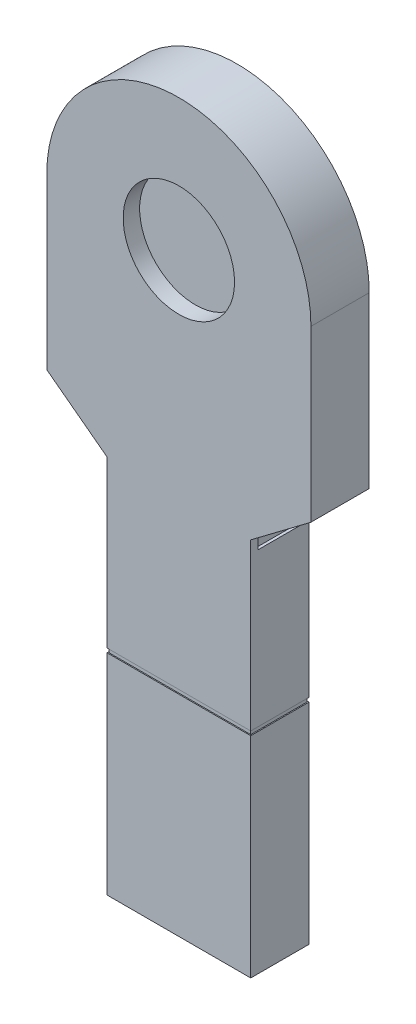
ISO-10303-21;
HEADER;
FILE_DESCRIPTION(('STEP AP214'),'2;1');
FILE_NAME('part.step','',(''),(''),'','','');
FILE_SCHEMA(('AUTOMOTIVE_DESIGN { 1 0 10303 214 1 1 1 1 }'));
ENDSEC;
DATA;
#1=APPLICATION_CONTEXT('core data for automotive mechanical design processes');
#2=APPLICATION_PROTOCOL_DEFINITION('international standard','automotive_design',2000,#1);
#3=PRODUCT_CONTEXT('',#1,'mechanical');
#4=PRODUCT('Part','Part','',(#3));
#5=PRODUCT_RELATED_PRODUCT_CATEGORY('part','',(#4));
#6=PRODUCT_DEFINITION_FORMATION('','',#4);
#7=PRODUCT_DEFINITION_CONTEXT('part definition',#1,'design');
#8=PRODUCT_DEFINITION('design','',#6,#7);
#9=PRODUCT_DEFINITION_SHAPE('','',#8);
#10=(LENGTH_UNIT() NAMED_UNIT(*) SI_UNIT(.MILLI.,.METRE.));
#11=(NAMED_UNIT(*) PLANE_ANGLE_UNIT() SI_UNIT($,.RADIAN.));
#12=(NAMED_UNIT(*) SI_UNIT($,.STERADIAN.) SOLID_ANGLE_UNIT());
#13=UNCERTAINTY_MEASURE_WITH_UNIT(LENGTH_MEASURE(1.E-05),#10,'distance_accuracy_value','');
#14=(GEOMETRIC_REPRESENTATION_CONTEXT(3) GLOBAL_UNCERTAINTY_ASSIGNED_CONTEXT((#13)) GLOBAL_UNIT_ASSIGNED_CONTEXT((#10,
#11,#12)) REPRESENTATION_CONTEXT('',''));
#15=CARTESIAN_POINT('',(0.,0.,0.));
#16=DIRECTION('',(0.,0.,1.));
#17=DIRECTION('',(1.,0.,0.));
#18=AXIS2_PLACEMENT_3D('',#15,#16,#17);
#19=CARTESIAN_POINT('',(-102.,-131.,45.));
#20=DIRECTION('',(0.601815023152047,0.798635510047294,0.));
#21=DIRECTION('',(-0.798635510047294,0.601815023152047,0.));
#22=AXIS2_PLACEMENT_3D('',#19,#20,#21);
#23=PLANE('',#22);
#24=DIRECTION('',(0.798635510047294,-0.601815023152047,0.));
#25=VECTOR('',#24,1.);
#26=CARTESIAN_POINT('',(-91.8573290223994,-138.643050794031,5.75));
#27=LINE('',#26,#25);
#28=CARTESIAN_POINT('',(-91.8573290223994,-138.643050794031,5.75));
#29=VERTEX_POINT('',#28);
#30=CARTESIAN_POINT('',(-55.4999999999996,-166.04026332978,5.74999999999999));
#31=VERTEX_POINT('',#30);
#32=EDGE_CURVE('E592',#29,#31,#27,.T.);
#33=ORIENTED_EDGE('',*,*,#32,.F.);
#34=DIRECTION('',(0.,0.,-1.));
#35=VECTOR('',#34,1.);
#36=CARTESIAN_POINT('',(-91.8573290223994,-138.643050794031,39.25));
#37=LINE('',#36,#35);
#38=CARTESIAN_POINT('',(-91.8573290223994,-138.643050794031,39.25));
#39=VERTEX_POINT('',#38);
#40=EDGE_CURVE('E587',#39,#29,#37,.T.);
#41=ORIENTED_EDGE('',*,*,#40,.F.);
#42=DIRECTION('',(0.798635510047294,-0.601815023152047,0.));
#43=VECTOR('',#42,1.);
#44=CARTESIAN_POINT('',(-91.8573290223994,-138.643050794031,39.25));
#45=LINE('',#44,#43);
#46=CARTESIAN_POINT('',(-55.4999999999996,-166.04026332978,39.25));
#47=VERTEX_POINT('',#46);
#48=EDGE_CURVE('E596',#39,#47,#45,.T.);
#49=ORIENTED_EDGE('',*,*,#48,.T.);
#50=DIRECTION('',(0.,0.,-1.));
#51=VECTOR('',#50,1.);
#52=CARTESIAN_POINT('',(-55.5,-166.04026332978,45.));
#53=LINE('',#52,#51);
#54=CARTESIAN_POINT('',(-55.5,-166.04026332978,45.));
#55=VERTEX_POINT('',#54);
#56=EDGE_CURVE('E305',#55,#47,#53,.T.);
#57=ORIENTED_EDGE('',*,*,#56,.F.);
#58=DIRECTION('',(0.798635510047294,-0.601815023152047,0.));
#59=VECTOR('',#58,1.);
#60=CARTESIAN_POINT('',(-102.,-131.,45.));
#61=LINE('',#60,#59);
#62=CARTESIAN_POINT('',(-102.,-131.,45.));
#63=VERTEX_POINT('',#62);
#64=EDGE_CURVE('E472',#63,#55,#61,.T.);
#65=ORIENTED_EDGE('',*,*,#64,.F.);
#66=DIRECTION('',(0.,0.,-1.));
#67=VECTOR('',#66,1.);
#68=CARTESIAN_POINT('',(-102.,-131.,45.));
#69=LINE('',#68,#67);
#70=CARTESIAN_POINT('',(-102.,-131.,0.));
#71=VERTEX_POINT('',#70);
#72=EDGE_CURVE('E50',#63,#71,#69,.T.);
#73=ORIENTED_EDGE('',*,*,#72,.T.);
#74=DIRECTION('',(0.798635510047294,-0.601815023152047,0.));
#75=VECTOR('',#74,1.);
#76=CARTESIAN_POINT('',(-102.,-131.,0.));
#77=LINE('',#76,#75);
#78=CARTESIAN_POINT('',(-55.5,-166.04026332978,0.));
#79=VERTEX_POINT('',#78);
#80=EDGE_CURVE('E272',#71,#79,#77,.T.);
#81=ORIENTED_EDGE('',*,*,#80,.T.);
#82=EDGE_CURVE('E256',#31,#79,#53,.T.);
#83=ORIENTED_EDGE('',*,*,#82,.F.);
#84=EDGE_LOOP('',(#33,#41,#49,#57,#65,#73,#81,#83));
#85=FACE_BOUND('',#84,.T.);
#86=ADVANCED_FACE('F40',(#85),#23,.F.);
#87=CARTESIAN_POINT('',(-55.5,-166.04026332978,45.));
#88=DIRECTION('',(1.,0.,0.));
#89=DIRECTION('',(0.,1.,0.));
#90=AXIS2_PLACEMENT_3D('',#87,#88,#89);
#91=PLANE('',#90);
#92=DIRECTION('',(0.,-1.,0.));
#93=VECTOR('',#92,1.);
#94=CARTESIAN_POINT('',(-55.5,-166.04026332978,0.));
#95=LINE('',#94,#93);
#96=CARTESIAN_POINT('',(-55.5,-293.84026332978,0.));
#97=VERTEX_POINT('',#96);
#98=EDGE_CURVE('E276',#79,#97,#95,.T.);
#99=ORIENTED_EDGE('',*,*,#98,.T.);
#100=DIRECTION('',(0.,0.,1.));
#101=VECTOR('',#100,1.);
#102=CARTESIAN_POINT('',(-55.5,-293.84026332978,0.));
#103=LINE('',#102,#101);
#104=CARTESIAN_POINT('',(-55.5,-293.84026332978,45.));
#105=VERTEX_POINT('',#104);
#106=EDGE_CURVE('E58',#97,#105,#103,.T.);
#107=ORIENTED_EDGE('',*,*,#106,.T.);
#108=DIRECTION('',(0.,-1.,0.));
#109=VECTOR('',#108,1.);
#110=CARTESIAN_POINT('',(-55.5,-166.04026332978,45.));
#111=LINE('',#110,#109);
#112=EDGE_CURVE('E475',#55,#105,#111,.T.);
#113=ORIENTED_EDGE('',*,*,#112,.F.);
#114=ORIENTED_EDGE('',*,*,#56,.T.);
#115=DIRECTION('',(0.,-1.,0.));
#116=VECTOR('',#115,1.);
#117=CARTESIAN_POINT('',(-55.4999999999996,-166.04026332978,39.25));
#118=LINE('',#117,#116);
#119=CARTESIAN_POINT('',(-55.4999999999996,-175.490610900131,39.25));
#120=VERTEX_POINT('',#119);
#121=EDGE_CURVE('E606',#47,#120,#118,.T.);
#122=ORIENTED_EDGE('',*,*,#121,.T.);
#123=DIRECTION('',(0.,0.,-1.));
#124=VECTOR('',#123,1.);
#125=CARTESIAN_POINT('',(-55.4999999999996,-175.490610900131,39.25));
#126=LINE('',#125,#124);
#127=CARTESIAN_POINT('',(-55.5,-175.490610900131,5.74999999999999));
#128=VERTEX_POINT('',#127);
#129=EDGE_CURVE('E610',#120,#128,#126,.T.);
#130=ORIENTED_EDGE('',*,*,#129,.T.);
#131=DIRECTION('',(0.,-1.,0.));
#132=VECTOR('',#131,1.);
#133=CARTESIAN_POINT('',(-55.4999999999996,-166.04026332978,5.74999999999999));
#134=LINE('',#133,#132);
#135=EDGE_CURVE('E601',#31,#128,#134,.T.);
#136=ORIENTED_EDGE('',*,*,#135,.F.);
#137=ORIENTED_EDGE('',*,*,#82,.T.);
#138=EDGE_LOOP('',(#99,#107,#113,#114,#122,#130,#136,#137));
#139=FACE_BOUND('',#138,.T.);
#140=ADVANCED_FACE('F448',(#139),#91,.F.);
#141=CARTESIAN_POINT('',(55.5,-459.04026332978,45.));
#142=DIRECTION('',(-1.,0.,0.));
#143=DIRECTION('',(0.,0.,1.));
#144=AXIS2_PLACEMENT_3D('',#141,#142,#143);
#145=PLANE('',#144);
#146=DIRECTION('',(0.,1.,0.));
#147=VECTOR('',#146,1.);
#148=CARTESIAN_POINT('',(55.5,-459.04026332978,45.));
#149=LINE('',#148,#147);
#150=CARTESIAN_POINT('',(55.5,-293.84026332978,45.));
#151=VERTEX_POINT('',#150);
#152=CARTESIAN_POINT('',(55.5,-166.04026332978,45.));
#153=VERTEX_POINT('',#152);
#154=EDGE_CURVE('E44',#151,#153,#149,.T.);
#155=ORIENTED_EDGE('',*,*,#154,.F.);
#156=DIRECTION('',(0.,0.,1.));
#157=VECTOR('',#156,1.);
#158=CARTESIAN_POINT('',(55.5,-293.84026332978,-6.59696900098822));
#159=LINE('',#158,#157);
#160=CARTESIAN_POINT('',(55.5,-293.84026332978,0.));
#161=VERTEX_POINT('',#160);
#162=EDGE_CURVE('E654',#161,#151,#159,.T.);
#163=ORIENTED_EDGE('',*,*,#162,.F.);
#164=DIRECTION('',(0.,1.,0.));
#165=VECTOR('',#164,1.);
#166=CARTESIAN_POINT('',(55.5,-459.04026332978,0.));
#167=LINE('',#166,#165);
#168=CARTESIAN_POINT('',(55.5,-166.04026332978,0.));
#169=VERTEX_POINT('',#168);
#170=EDGE_CURVE('E281',#161,#169,#167,.T.);
#171=ORIENTED_EDGE('',*,*,#170,.T.);
#172=DIRECTION('',(0.,0.,-1.));
#173=VECTOR('',#172,1.);
#174=CARTESIAN_POINT('',(55.5,-166.04026332978,45.));
#175=LINE('',#174,#173);
#176=CARTESIAN_POINT('',(55.4999999999996,-166.04026332978,5.74999999999999));
#177=VERTEX_POINT('',#176);
#178=EDGE_CURVE('E293',#177,#169,#175,.T.);
#179=ORIENTED_EDGE('',*,*,#178,.F.);
#180=DIRECTION('',(0.,-1.,0.));
#181=VECTOR('',#180,1.);
#182=CARTESIAN_POINT('',(55.4999999999996,-166.04026332978,5.74999999999999));
#183=LINE('',#182,#181);
#184=CARTESIAN_POINT('',(55.4999999999996,-175.490610900131,5.74999999999999));
#185=VERTEX_POINT('',#184);
#186=EDGE_CURVE('E500',#177,#185,#183,.T.);
#187=ORIENTED_EDGE('',*,*,#186,.T.);
#188=DIRECTION('',(0.,0.,-1.));
#189=VECTOR('',#188,1.);
#190=CARTESIAN_POINT('',(55.4999999999996,-175.490610900131,39.25));
#191=LINE('',#190,#189);
#192=CARTESIAN_POINT('',(55.4999999999996,-175.490610900131,39.25));
#193=VERTEX_POINT('',#192);
#194=EDGE_CURVE('E494',#193,#185,#191,.T.);
#195=ORIENTED_EDGE('',*,*,#194,.F.);
#196=DIRECTION('',(0.,-1.,0.));
#197=VECTOR('',#196,1.);
#198=CARTESIAN_POINT('',(55.4999999999996,-166.04026332978,39.25));
#199=LINE('',#198,#197);
#200=CARTESIAN_POINT('',(55.4999999999996,-166.04026332978,39.25));
#201=VERTEX_POINT('',#200);
#202=EDGE_CURVE('E503',#201,#193,#199,.T.);
#203=ORIENTED_EDGE('',*,*,#202,.F.);
#204=EDGE_CURVE('E301',#153,#201,#175,.T.);
#205=ORIENTED_EDGE('',*,*,#204,.F.);
#206=EDGE_LOOP('',(#155,#163,#171,#179,#187,#195,#203,#205));
#207=FACE_BOUND('',#206,.T.);
#208=ADVANCED_FACE('F444',(#207),#145,.F.);
#209=CARTESIAN_POINT('',(102.,-131.,45.));
#210=DIRECTION('',(-0.601815023152047,0.798635510047294,0.));
#211=DIRECTION('',(-0.798635510047294,-0.601815023152047,0.));
#212=AXIS2_PLACEMENT_3D('',#209,#210,#211);
#213=PLANE('',#212);
#214=DIRECTION('',(-0.798635510047294,-0.601815023152047,0.));
#215=VECTOR('',#214,1.);
#216=CARTESIAN_POINT('',(91.8573290223994,-138.643050794031,5.75));
#217=LINE('',#216,#215);
#218=CARTESIAN_POINT('',(91.8573290223994,-138.643050794031,5.75));
#219=VERTEX_POINT('',#218);
#220=EDGE_CURVE('E509',#219,#177,#217,.T.);
#221=ORIENTED_EDGE('',*,*,#220,.T.);
#222=ORIENTED_EDGE('',*,*,#178,.T.);
#223=DIRECTION('',(0.798635510047294,0.601815023152047,0.));
#224=VECTOR('',#223,1.);
#225=CARTESIAN_POINT('',(102.,-131.,0.));
#226=LINE('',#225,#224);
#227=CARTESIAN_POINT('',(102.,-131.,0.));
#228=VERTEX_POINT('',#227);
#229=EDGE_CURVE('E283',#169,#228,#226,.T.);
#230=ORIENTED_EDGE('',*,*,#229,.T.);
#231=DIRECTION('',(0.,0.,-1.));
#232=VECTOR('',#231,1.);
#233=CARTESIAN_POINT('',(102.,-131.,45.));
#234=LINE('',#233,#232);
#235=CARTESIAN_POINT('',(102.,-131.,45.));
#236=VERTEX_POINT('',#235);
#237=EDGE_CURVE('E290',#236,#228,#234,.T.);
#238=ORIENTED_EDGE('',*,*,#237,.F.);
#239=DIRECTION('',(0.798635510047294,0.601815023152047,0.));
#240=VECTOR('',#239,1.);
#241=CARTESIAN_POINT('',(102.,-131.,45.));
#242=LINE('',#241,#240);
#243=EDGE_CURVE('E252',#153,#236,#242,.T.);
#244=ORIENTED_EDGE('',*,*,#243,.F.);
#245=ORIENTED_EDGE('',*,*,#204,.T.);
#246=DIRECTION('',(-0.798635510047294,-0.601815023152047,0.));
#247=VECTOR('',#246,1.);
#248=CARTESIAN_POINT('',(91.8573290223994,-138.643050794031,39.25));
#249=LINE('',#248,#247);
#250=CARTESIAN_POINT('',(91.8573290223994,-138.643050794031,39.25));
#251=VERTEX_POINT('',#250);
#252=EDGE_CURVE('E517',#251,#201,#249,.T.);
#253=ORIENTED_EDGE('',*,*,#252,.F.);
#254=DIRECTION('',(0.,0.,-1.));
#255=VECTOR('',#254,1.);
#256=CARTESIAN_POINT('',(91.8573290223994,-138.643050794031,39.25));
#257=LINE('',#256,#255);
#258=EDGE_CURVE('E514',#251,#219,#257,.T.);
#259=ORIENTED_EDGE('',*,*,#258,.T.);
#260=EDGE_LOOP('',(#221,#222,#230,#238,#244,#245,#253,#259));
#261=FACE_BOUND('',#260,.T.);
#262=ADVANCED_FACE('F441',(#261),#213,.F.);
#263=CARTESIAN_POINT('',(0.,0.,45.));
#264=DIRECTION('',(0.,0.,-1.));
#265=DIRECTION('',(-1.,0.,0.));
#266=AXIS2_PLACEMENT_3D('',#263,#264,#265);
#267=CYLINDRICAL_SURFACE('',#266,102.);
#268=CARTESIAN_POINT('',(0.,0.,0.));
#269=DIRECTION('',(0.,0.,1.));
#270=DIRECTION('',(1.,0.,0.));
#271=AXIS2_PLACEMENT_3D('',#268,#269,#270);
#272=CIRCLE('',#271,102.);
#273=CARTESIAN_POINT('',(102.,0.,0.));
#274=VERTEX_POINT('',#273);
#275=CARTESIAN_POINT('',(-102.,0.,0.));
#276=VERTEX_POINT('',#275);
#277=EDGE_CURVE('E266',#274,#276,#272,.T.);
#278=ORIENTED_EDGE('',*,*,#277,.T.);
#279=DIRECTION('',(0.,0.,-1.));
#280=VECTOR('',#279,1.);
#281=CARTESIAN_POINT('',(-102.,0.,45.));
#282=LINE('',#281,#280);
#283=CARTESIAN_POINT('',(-102.,0.,45.));
#284=VERTEX_POINT('',#283);
#285=EDGE_CURVE('E12',#284,#276,#282,.T.);
#286=ORIENTED_EDGE('',*,*,#285,.F.);
#287=CARTESIAN_POINT('',(0.,0.,45.));
#288=DIRECTION('',(0.,0.,1.));
#289=DIRECTION('',(1.,0.,0.));
#290=AXIS2_PLACEMENT_3D('',#287,#288,#289);
#291=CIRCLE('',#290,102.);
#292=CARTESIAN_POINT('',(102.,0.,45.));
#293=VERTEX_POINT('',#292);
#294=EDGE_CURVE('E287',#293,#284,#291,.T.);
#295=ORIENTED_EDGE('',*,*,#294,.F.);
#296=DIRECTION('',(0.,0.,-1.));
#297=VECTOR('',#296,1.);
#298=CARTESIAN_POINT('',(102.,0.,45.));
#299=LINE('',#298,#297);
#300=EDGE_CURVE('E265',#293,#274,#299,.T.);
#301=ORIENTED_EDGE('',*,*,#300,.T.);
#302=EDGE_LOOP('',(#278,#286,#295,#301));
#303=FACE_BOUND('',#302,.T.);
#304=ADVANCED_FACE('F42',(#303),#267,.T.);
#305=CARTESIAN_POINT('',(-102.,0.,45.));
#306=DIRECTION('',(1.,0.,0.));
#307=DIRECTION('',(0.,1.,0.));
#308=AXIS2_PLACEMENT_3D('',#305,#306,#307);
#309=PLANE('',#308);
#310=DIRECTION('',(0.,-1.,0.));
#311=VECTOR('',#310,1.);
#312=CARTESIAN_POINT('',(-102.,0.,0.));
#313=LINE('',#312,#311);
#314=EDGE_CURVE('E269',#276,#71,#313,.T.);
#315=ORIENTED_EDGE('',*,*,#314,.T.);
#316=ORIENTED_EDGE('',*,*,#72,.F.);
#317=DIRECTION('',(0.,-1.,0.));
#318=VECTOR('',#317,1.);
#319=CARTESIAN_POINT('',(-102.,0.,45.));
#320=LINE('',#319,#318);
#321=EDGE_CURVE('E482',#284,#63,#320,.T.);
#322=ORIENTED_EDGE('',*,*,#321,.F.);
#323=ORIENTED_EDGE('',*,*,#285,.T.);
#324=EDGE_LOOP('',(#315,#316,#322,#323));
#325=FACE_BOUND('',#324,.T.);
#326=ADVANCED_FACE('F439',(#325),#309,.F.);
#327=CARTESIAN_POINT('',(102.,0.,45.));
#328=DIRECTION('',(-1.,0.,0.));
#329=DIRECTION('',(0.,-1.,0.));
#330=AXIS2_PLACEMENT_3D('',#327,#328,#329);
#331=PLANE('',#330);
#332=DIRECTION('',(0.,1.,0.));
#333=VECTOR('',#332,1.);
#334=CARTESIAN_POINT('',(102.,0.,0.));
#335=LINE('',#334,#333);
#336=EDGE_CURVE('E285',#228,#274,#335,.T.);
#337=ORIENTED_EDGE('',*,*,#336,.T.);
#338=ORIENTED_EDGE('',*,*,#300,.F.);
#339=DIRECTION('',(0.,1.,0.));
#340=VECTOR('',#339,1.);
#341=CARTESIAN_POINT('',(102.,0.,45.));
#342=LINE('',#341,#340);
#343=EDGE_CURVE('E253',#236,#293,#342,.T.);
#344=ORIENTED_EDGE('',*,*,#343,.F.);
#345=ORIENTED_EDGE('',*,*,#237,.T.);
#346=EDGE_LOOP('',(#337,#338,#344,#345));
#347=FACE_BOUND('',#346,.T.);
#348=ADVANCED_FACE('F432',(#347),#331,.F.);
#349=CARTESIAN_POINT('',(0.,0.,45.));
#350=DIRECTION('',(0.,0.,1.));
#351=DIRECTION('',(1.,0.,0.));
#352=AXIS2_PLACEMENT_3D('',#349,#350,#351);
#353=PLANE('',#352);
#354=DIRECTION('',(1.,0.,0.));
#355=VECTOR('',#354,1.);
#356=CARTESIAN_POINT('',(-55.5,-293.84026332978,45.));
#357=LINE('',#356,#355);
#358=EDGE_CURVE('E234',#105,#151,#357,.T.);
#359=ORIENTED_EDGE('',*,*,#358,.T.);
#360=ORIENTED_EDGE('',*,*,#154,.T.);
#361=ORIENTED_EDGE('',*,*,#243,.T.);
#362=ORIENTED_EDGE('',*,*,#343,.T.);
#363=ORIENTED_EDGE('',*,*,#294,.T.);
#364=ORIENTED_EDGE('',*,*,#321,.T.);
#365=ORIENTED_EDGE('',*,*,#64,.T.);
#366=ORIENTED_EDGE('',*,*,#112,.T.);
#367=EDGE_LOOP('',(#359,#360,#361,#362,#363,#364,#365,#366));
#368=FACE_BOUND('',#367,.T.);
#369=CARTESIAN_POINT('',(0.,0.,45.));
#370=DIRECTION('',(0.,0.,1.));
#371=DIRECTION('',(1.,0.,0.));
#372=AXIS2_PLACEMENT_3D('',#369,#370,#371);
#373=CIRCLE('',#372,43.);
#374=CARTESIAN_POINT('',(43.,0.,45.));
#375=VERTEX_POINT('',#374);
#376=EDGE_CURVE('E486',#375,#375,#373,.T.);
#377=ORIENTED_EDGE('',*,*,#376,.F.);
#378=EDGE_LOOP('',(#377));
#379=FACE_BOUND('',#378,.T.);
#380=ADVANCED_FACE('F429',(#368,#379),#353,.T.);
#381=CARTESIAN_POINT('',(0.,0.,0.));
#382=DIRECTION('',(0.,0.,1.));
#383=DIRECTION('',(1.,0.,0.));
#384=AXIS2_PLACEMENT_3D('',#381,#382,#383);
#385=PLANE('',#384);
#386=ORIENTED_EDGE('',*,*,#170,.F.);
#387=DIRECTION('',(-1.,0.,0.));
#388=VECTOR('',#387,1.);
#389=CARTESIAN_POINT('',(55.5,-293.84026332978,0.));
#390=LINE('',#389,#388);
#391=EDGE_CURVE('E324',#161,#97,#390,.T.);
#392=ORIENTED_EDGE('',*,*,#391,.T.);
#393=ORIENTED_EDGE('',*,*,#98,.F.);
#394=ORIENTED_EDGE('',*,*,#80,.F.);
#395=ORIENTED_EDGE('',*,*,#314,.F.);
#396=ORIENTED_EDGE('',*,*,#277,.F.);
#397=ORIENTED_EDGE('',*,*,#336,.F.);
#398=ORIENTED_EDGE('',*,*,#229,.F.);
#399=EDGE_LOOP('',(#386,#392,#393,#394,#395,#396,#397,#398));
#400=FACE_BOUND('',#399,.T.);
#401=ADVANCED_FACE('F427',(#400),#385,.F.);
#402=CARTESIAN_POINT('',(0.,0.,32.3));
#403=DIRECTION('',(0.,0.,1.));
#404=DIRECTION('',(1.,0.,0.));
#405=AXIS2_PLACEMENT_3D('',#402,#403,#404);
#406=CYLINDRICAL_SURFACE('',#405,43.);
#407=CARTESIAN_POINT('',(0.,0.,32.3));
#408=DIRECTION('',(0.,0.,1.));
#409=DIRECTION('',(1.,0.,0.));
#410=AXIS2_PLACEMENT_3D('',#407,#408,#409);
#411=CIRCLE('',#410,43.);
#412=CARTESIAN_POINT('',(43.,0.,32.3));
#413=VERTEX_POINT('',#412);
#414=EDGE_CURVE('E270',#413,#413,#411,.T.);
#415=ORIENTED_EDGE('',*,*,#414,.F.);
#416=EDGE_LOOP('',(#415));
#417=FACE_BOUND('',#416,.T.);
#418=ORIENTED_EDGE('',*,*,#376,.T.);
#419=EDGE_LOOP('',(#418));
#420=FACE_BOUND('',#419,.T.);
#421=ADVANCED_FACE('F423',(#417,#420),#406,.F.);
#422=CARTESIAN_POINT('',(0.,0.,32.3));
#423=DIRECTION('',(0.,0.,1.));
#424=DIRECTION('',(1.,0.,0.));
#425=AXIS2_PLACEMENT_3D('',#422,#423,#424);
#426=PLANE('',#425);
#427=ORIENTED_EDGE('',*,*,#414,.T.);
#428=EDGE_LOOP('',(#427));
#429=FACE_BOUND('',#428,.T.);
#430=ADVANCED_FACE('F414',(#429),#426,.T.);
#431=CARTESIAN_POINT('',(0.,0.,5.75));
#432=DIRECTION('',(0.,0.,1.));
#433=DIRECTION('',(1.,0.,0.));
#434=AXIS2_PLACEMENT_3D('',#431,#432,#433);
#435=PLANE('',#434);
#436=DIRECTION('',(0.,1.,0.));
#437=VECTOR('',#436,1.);
#438=CARTESIAN_POINT('',(53.3161668395111,-175.490610900131,5.74999999999999));
#439=LINE('',#438,#437);
#440=CARTESIAN_POINT('',(53.3161668395111,-175.490610900131,5.74999999999999));
#441=VERTEX_POINT('',#440);
#442=CARTESIAN_POINT('',(53.3161668395111,-155.790610900131,5.74999999999999));
#443=VERTEX_POINT('',#442);
#444=EDGE_CURVE('E545',#441,#443,#439,.T.);
#445=ORIENTED_EDGE('',*,*,#444,.F.);
#446=DIRECTION('',(-1.,0.,0.));
#447=VECTOR('',#446,1.);
#448=CARTESIAN_POINT('',(55.4999999999996,-175.490610900131,5.74999999999999));
#449=LINE('',#448,#447);
#450=EDGE_CURVE('E497',#185,#441,#449,.T.);
#451=ORIENTED_EDGE('',*,*,#450,.F.);
#452=ORIENTED_EDGE('',*,*,#186,.F.);
#453=ORIENTED_EDGE('',*,*,#220,.F.);
#454=DIRECTION('',(0.601815023152048,-0.798635510047293,0.));
#455=VECTOR('',#454,1.);
#456=CARTESIAN_POINT('',(86.1400863024549,-131.056013448582,5.75000000000001));
#457=LINE('',#456,#455);
#458=CARTESIAN_POINT('',(86.1400863024549,-131.056013448582,5.75000000000001));
#459=VERTEX_POINT('',#458);
#460=EDGE_CURVE('E519',#459,#219,#457,.T.);
#461=ORIENTED_EDGE('',*,*,#460,.F.);
#462=DIRECTION('',(0.798635510047295,0.601815023152045,0.));
#463=VECTOR('',#462,1.);
#464=CARTESIAN_POINT('',(53.3161668395111,-155.790610900131,5.74999999999999));
#465=LINE('',#464,#463);
#466=EDGE_CURVE('E534',#443,#459,#465,.T.);
#467=ORIENTED_EDGE('',*,*,#466,.F.);
#468=EDGE_LOOP('',(#445,#451,#452,#453,#461,#467));
#469=FACE_BOUND('',#468,.T.);
#470=ADVANCED_FACE('F390',(#469),#435,.T.);
#471=CARTESIAN_POINT('',(0.,0.,39.25));
#472=DIRECTION('',(0.,0.,1.));
#473=DIRECTION('',(1.,0.,0.));
#474=AXIS2_PLACEMENT_3D('',#471,#472,#473);
#475=PLANE('',#474);
#476=DIRECTION('',(0.,1.,0.));
#477=VECTOR('',#476,1.);
#478=CARTESIAN_POINT('',(53.3161668395111,-175.490610900131,39.25));
#479=LINE('',#478,#477);
#480=CARTESIAN_POINT('',(53.3161668395111,-175.490610900131,39.25));
#481=VERTEX_POINT('',#480);
#482=CARTESIAN_POINT('',(53.3161668395111,-155.790610900131,39.25));
#483=VERTEX_POINT('',#482);
#484=EDGE_CURVE('E489',#481,#483,#479,.T.);
#485=ORIENTED_EDGE('',*,*,#484,.T.);
#486=DIRECTION('',(0.798635510047295,0.601815023152045,0.));
#487=VECTOR('',#486,1.);
#488=CARTESIAN_POINT('',(53.3161668395111,-155.790610900131,39.25));
#489=LINE('',#488,#487);
#490=CARTESIAN_POINT('',(86.1400863024549,-131.056013448582,39.25));
#491=VERTEX_POINT('',#490);
#492=EDGE_CURVE('E547',#483,#491,#489,.T.);
#493=ORIENTED_EDGE('',*,*,#492,.T.);
#494=DIRECTION('',(0.601815023152048,-0.798635510047293,0.));
#495=VECTOR('',#494,1.);
#496=CARTESIAN_POINT('',(86.1400863024549,-131.056013448582,39.25));
#497=LINE('',#496,#495);
#498=EDGE_CURVE('E531',#491,#251,#497,.T.);
#499=ORIENTED_EDGE('',*,*,#498,.T.);
#500=ORIENTED_EDGE('',*,*,#252,.T.);
#501=ORIENTED_EDGE('',*,*,#202,.T.);
#502=DIRECTION('',(-1.,0.,0.));
#503=VECTOR('',#502,1.);
#504=CARTESIAN_POINT('',(55.4999999999996,-175.490610900131,39.25));
#505=LINE('',#504,#503);
#506=EDGE_CURVE('E496',#193,#481,#505,.T.);
#507=ORIENTED_EDGE('',*,*,#506,.T.);
#508=EDGE_LOOP('',(#485,#493,#499,#500,#501,#507));
#509=FACE_BOUND('',#508,.T.);
#510=ADVANCED_FACE('F402',(#509),#475,.F.);
#511=CARTESIAN_POINT('',(55.4999999999996,-175.490610900131,39.25));
#512=DIRECTION('',(0.,-1.,0.));
#513=DIRECTION('',(1.,0.,0.));
#514=AXIS2_PLACEMENT_3D('',#511,#512,#513);
#515=PLANE('',#514);
#516=ORIENTED_EDGE('',*,*,#450,.T.);
#517=DIRECTION('',(0.,0.,-1.));
#518=VECTOR('',#517,1.);
#519=CARTESIAN_POINT('',(53.3161668395111,-175.490610900131,39.25));
#520=LINE('',#519,#518);
#521=EDGE_CURVE('E504',#481,#441,#520,.T.);
#522=ORIENTED_EDGE('',*,*,#521,.F.);
#523=ORIENTED_EDGE('',*,*,#506,.F.);
#524=ORIENTED_EDGE('',*,*,#194,.T.);
#525=EDGE_LOOP('',(#516,#522,#523,#524));
#526=FACE_BOUND('',#525,.T.);
#527=ADVANCED_FACE('F398',(#526),#515,.F.);
#528=CARTESIAN_POINT('',(86.1400863024549,-131.056013448582,39.25));
#529=DIRECTION('',(0.798635510047293,0.601815023152048,0.));
#530=DIRECTION('',(-0.601815023152048,0.798635510047293,0.));
#531=AXIS2_PLACEMENT_3D('',#528,#529,#530);
#532=PLANE('',#531);
#533=ORIENTED_EDGE('',*,*,#460,.T.);
#534=ORIENTED_EDGE('',*,*,#258,.F.);
#535=ORIENTED_EDGE('',*,*,#498,.F.);
#536=DIRECTION('',(0.,0.,-1.));
#537=VECTOR('',#536,1.);
#538=CARTESIAN_POINT('',(86.1400863024549,-131.056013448582,39.25));
#539=LINE('',#538,#537);
#540=EDGE_CURVE('E528',#491,#459,#539,.T.);
#541=ORIENTED_EDGE('',*,*,#540,.T.);
#542=EDGE_LOOP('',(#533,#534,#535,#541));
#543=FACE_BOUND('',#542,.T.);
#544=ADVANCED_FACE('F401',(#543),#532,.F.);
#545=CARTESIAN_POINT('',(53.3161668395111,-155.790610900131,39.25));
#546=DIRECTION('',(-0.601815023152045,0.798635510047295,0.));
#547=DIRECTION('',(-0.798635510047295,-0.601815023152045,0.));
#548=AXIS2_PLACEMENT_3D('',#545,#546,#547);
#549=PLANE('',#548);
#550=ORIENTED_EDGE('',*,*,#466,.T.);
#551=ORIENTED_EDGE('',*,*,#540,.F.);
#552=ORIENTED_EDGE('',*,*,#492,.F.);
#553=DIRECTION('',(0.,0.,-1.));
#554=VECTOR('',#553,1.);
#555=CARTESIAN_POINT('',(53.3161668395111,-155.790610900131,39.25));
#556=LINE('',#555,#554);
#557=EDGE_CURVE('E542',#483,#443,#556,.T.);
#558=ORIENTED_EDGE('',*,*,#557,.T.);
#559=EDGE_LOOP('',(#550,#551,#552,#558));
#560=FACE_BOUND('',#559,.T.);
#561=ADVANCED_FACE('F406',(#560),#549,.F.);
#562=CARTESIAN_POINT('',(53.3161668395111,-175.490610900131,39.25));
#563=DIRECTION('',(-1.,0.,0.));
#564=DIRECTION('',(0.,-1.,0.));
#565=AXIS2_PLACEMENT_3D('',#562,#563,#564);
#566=PLANE('',#565);
#567=ORIENTED_EDGE('',*,*,#444,.T.);
#568=ORIENTED_EDGE('',*,*,#557,.F.);
#569=ORIENTED_EDGE('',*,*,#484,.F.);
#570=ORIENTED_EDGE('',*,*,#521,.T.);
#571=EDGE_LOOP('',(#567,#568,#569,#570));
#572=FACE_BOUND('',#571,.T.);
#573=ADVANCED_FACE('F396',(#572),#566,.F.);
#574=CARTESIAN_POINT('',(0.,0.,5.75));
#575=DIRECTION('',(0.,0.,1.));
#576=DIRECTION('',(1.,0.,0.));
#577=AXIS2_PLACEMENT_3D('',#574,#575,#576);
#578=PLANE('',#577);
#579=DIRECTION('',(1.,0.,0.));
#580=VECTOR('',#579,1.);
#581=CARTESIAN_POINT('',(-55.4999999999996,-175.490610900131,5.74999999999999));
#582=LINE('',#581,#580);
#583=CARTESIAN_POINT('',(-53.3161668395111,-175.490610900131,5.74999999999999));
#584=VERTEX_POINT('',#583);
#585=EDGE_CURVE('E615',#128,#584,#582,.T.);
#586=ORIENTED_EDGE('',*,*,#585,.T.);
#587=DIRECTION('',(0.,1.,0.));
#588=VECTOR('',#587,1.);
#589=CARTESIAN_POINT('',(-53.3161668395111,-175.490610900131,5.74999999999999));
#590=LINE('',#589,#588);
#591=CARTESIAN_POINT('',(-53.3161668395111,-155.790610900131,5.74999999999999));
#592=VERTEX_POINT('',#591);
#593=EDGE_CURVE('E623',#584,#592,#590,.T.);
#594=ORIENTED_EDGE('',*,*,#593,.T.);
#595=DIRECTION('',(-0.798635510047295,0.601815023152045,0.));
#596=VECTOR('',#595,1.);
#597=CARTESIAN_POINT('',(-53.3161668395111,-155.790610900131,5.74999999999999));
#598=LINE('',#597,#596);
#599=CARTESIAN_POINT('',(-86.1400863024549,-131.056013448582,5.75000000000001));
#600=VERTEX_POINT('',#599);
#601=EDGE_CURVE('E618',#592,#600,#598,.T.);
#602=ORIENTED_EDGE('',*,*,#601,.T.);
#603=DIRECTION('',(-0.601815023152048,-0.798635510047293,0.));
#604=VECTOR('',#603,1.);
#605=CARTESIAN_POINT('',(-86.1400863024549,-131.056013448582,5.75000000000001));
#606=LINE('',#605,#604);
#607=EDGE_CURVE('E577',#600,#29,#606,.T.);
#608=ORIENTED_EDGE('',*,*,#607,.T.);
#609=ORIENTED_EDGE('',*,*,#32,.T.);
#610=ORIENTED_EDGE('',*,*,#135,.T.);
#611=EDGE_LOOP('',(#586,#594,#602,#608,#609,#610));
#612=FACE_BOUND('',#611,.T.);
#613=ADVANCED_FACE('F372',(#612),#578,.T.);
#614=CARTESIAN_POINT('',(0.,0.,39.25));
#615=DIRECTION('',(0.,0.,1.));
#616=DIRECTION('',(1.,0.,0.));
#617=AXIS2_PLACEMENT_3D('',#614,#615,#616);
#618=PLANE('',#617);
#619=DIRECTION('',(1.,0.,0.));
#620=VECTOR('',#619,1.);
#621=CARTESIAN_POINT('',(-55.4999999999996,-175.490610900131,39.25));
#622=LINE('',#621,#620);
#623=CARTESIAN_POINT('',(-53.3161668395111,-175.490610900131,39.25));
#624=VERTEX_POINT('',#623);
#625=EDGE_CURVE('E629',#120,#624,#622,.T.);
#626=ORIENTED_EDGE('',*,*,#625,.F.);
#627=ORIENTED_EDGE('',*,*,#121,.F.);
#628=ORIENTED_EDGE('',*,*,#48,.F.);
#629=DIRECTION('',(-0.601815023152048,-0.798635510047293,0.));
#630=VECTOR('',#629,1.);
#631=CARTESIAN_POINT('',(-86.1400863024549,-131.056013448582,39.25));
#632=LINE('',#631,#630);
#633=CARTESIAN_POINT('',(-86.1400863024549,-131.056013448582,39.25));
#634=VERTEX_POINT('',#633);
#635=EDGE_CURVE('E582',#634,#39,#632,.T.);
#636=ORIENTED_EDGE('',*,*,#635,.F.);
#637=DIRECTION('',(-0.798635510047295,0.601815023152045,0.));
#638=VECTOR('',#637,1.);
#639=CARTESIAN_POINT('',(-53.3161668395111,-155.790610900131,39.25));
#640=LINE('',#639,#638);
#641=CARTESIAN_POINT('',(-53.3161668395111,-155.790610900131,39.25));
#642=VERTEX_POINT('',#641);
#643=EDGE_CURVE('E578',#642,#634,#640,.T.);
#644=ORIENTED_EDGE('',*,*,#643,.F.);
#645=DIRECTION('',(0.,1.,0.));
#646=VECTOR('',#645,1.);
#647=CARTESIAN_POINT('',(-53.3161668395111,-175.490610900131,39.25));
#648=LINE('',#647,#646);
#649=EDGE_CURVE('E551',#624,#642,#648,.T.);
#650=ORIENTED_EDGE('',*,*,#649,.F.);
#651=EDGE_LOOP('',(#626,#627,#628,#636,#644,#650));
#652=FACE_BOUND('',#651,.T.);
#653=ADVANCED_FACE('F378',(#652),#618,.F.);
#654=CARTESIAN_POINT('',(-53.3161668395111,-155.790610900131,39.25));
#655=DIRECTION('',(-0.601815023152045,-0.798635510047295,0.));
#656=DIRECTION('',(0.798635510047295,-0.601815023152045,0.));
#657=AXIS2_PLACEMENT_3D('',#654,#655,#656);
#658=PLANE('',#657);
#659=ORIENTED_EDGE('',*,*,#601,.F.);
#660=DIRECTION('',(0.,0.,-1.));
#661=VECTOR('',#660,1.);
#662=CARTESIAN_POINT('',(-53.3161668395111,-155.790610900131,39.25));
#663=LINE('',#662,#661);
#664=EDGE_CURVE('E620',#642,#592,#663,.T.);
#665=ORIENTED_EDGE('',*,*,#664,.F.);
#666=ORIENTED_EDGE('',*,*,#643,.T.);
#667=DIRECTION('',(0.,0.,-1.));
#668=VECTOR('',#667,1.);
#669=CARTESIAN_POINT('',(-86.1400863024549,-131.056013448582,39.25));
#670=LINE('',#669,#668);
#671=EDGE_CURVE('E574',#634,#600,#670,.T.);
#672=ORIENTED_EDGE('',*,*,#671,.T.);
#673=EDGE_LOOP('',(#659,#665,#666,#672));
#674=FACE_BOUND('',#673,.T.);
#675=ADVANCED_FACE('F374',(#674),#658,.T.);
#676=CARTESIAN_POINT('',(-86.1400863024549,-131.056013448582,39.25));
#677=DIRECTION('',(0.798635510047293,-0.601815023152048,0.));
#678=DIRECTION('',(0.601815023152048,0.798635510047293,0.));
#679=AXIS2_PLACEMENT_3D('',#676,#677,#678);
#680=PLANE('',#679);
#681=ORIENTED_EDGE('',*,*,#607,.F.);
#682=ORIENTED_EDGE('',*,*,#671,.F.);
#683=ORIENTED_EDGE('',*,*,#635,.T.);
#684=ORIENTED_EDGE('',*,*,#40,.T.);
#685=EDGE_LOOP('',(#681,#682,#683,#684));
#686=FACE_BOUND('',#685,.T.);
#687=ADVANCED_FACE('F377',(#686),#680,.T.);
#688=CARTESIAN_POINT('',(-55.4999999999996,-175.490610900131,39.25));
#689=DIRECTION('',(0.,1.,0.));
#690=DIRECTION('',(-1.,0.,0.));
#691=AXIS2_PLACEMENT_3D('',#688,#689,#690);
#692=PLANE('',#691);
#693=ORIENTED_EDGE('',*,*,#585,.F.);
#694=ORIENTED_EDGE('',*,*,#129,.F.);
#695=ORIENTED_EDGE('',*,*,#625,.T.);
#696=DIRECTION('',(0.,0.,-1.));
#697=VECTOR('',#696,1.);
#698=CARTESIAN_POINT('',(-53.3161668395111,-175.490610900131,39.25));
#699=LINE('',#698,#697);
#700=EDGE_CURVE('E625',#624,#584,#699,.T.);
#701=ORIENTED_EDGE('',*,*,#700,.T.);
#702=EDGE_LOOP('',(#693,#694,#695,#701));
#703=FACE_BOUND('',#702,.T.);
#704=ADVANCED_FACE('F382',(#703),#692,.T.);
#705=CARTESIAN_POINT('',(-53.3161668395111,-175.490610900131,39.25));
#706=DIRECTION('',(-1.,0.,0.));
#707=DIRECTION('',(0.,-1.,0.));
#708=AXIS2_PLACEMENT_3D('',#705,#706,#707);
#709=PLANE('',#708);
#710=ORIENTED_EDGE('',*,*,#593,.F.);
#711=ORIENTED_EDGE('',*,*,#700,.F.);
#712=ORIENTED_EDGE('',*,*,#649,.T.);
#713=ORIENTED_EDGE('',*,*,#664,.T.);
#714=EDGE_LOOP('',(#710,#711,#712,#713));
#715=FACE_BOUND('',#714,.T.);
#716=ADVANCED_FACE('F371',(#715),#709,.T.);
#717=CARTESIAN_POINT('',(-54.7,-293.84026332978,44.2));
#718=DIRECTION('',(0.,0.,1.));
#719=DIRECTION('',(1.,0.,0.));
#720=AXIS2_PLACEMENT_3D('',#717,#718,#719);
#721=PLANE('',#720);
#722=CARTESIAN_POINT('',(54.7,-297.04026332978,44.2));
#723=DIRECTION('',(0.,1.,0.));
#724=VECTOR('',#723,1.);
#725=LINE('',#722,#724);
#726=CARTESIAN_POINT('',(54.7,-297.04026332978,44.2));
#727=VERTEX_POINT('',#726);
#728=CARTESIAN_POINT('',(54.7,-293.84026332978,44.2));
#729=VERTEX_POINT('',#728);
#730=EDGE_CURVE('E353',#727,#729,#725,.T.);
#731=ORIENTED_EDGE('',*,*,#730,.T.);
#732=DIRECTION('',(1.,0.,0.));
#733=VECTOR('',#732,1.);
#734=CARTESIAN_POINT('',(-54.7,-293.84026332978,44.2));
#735=LINE('',#734,#733);
#736=CARTESIAN_POINT('',(-54.7,-293.84026332978,44.2));
#737=VERTEX_POINT('',#736);
#738=EDGE_CURVE('E691',#737,#729,#735,.T.);
#739=ORIENTED_EDGE('',*,*,#738,.F.);
#740=DIRECTION('',(0.,-1.,0.));
#741=VECTOR('',#740,1.);
#742=CARTESIAN_POINT('',(-54.7,-293.84026332978,44.2));
#743=LINE('',#742,#741);
#744=CARTESIAN_POINT('',(-54.7,-297.04026332978,44.2));
#745=VERTEX_POINT('',#744);
#746=EDGE_CURVE('E347',#737,#745,#743,.T.);
#747=ORIENTED_EDGE('',*,*,#746,.T.);
#748=DIRECTION('',(1.,0.,0.));
#749=VECTOR('',#748,1.);
#750=CARTESIAN_POINT('',(-54.7,-297.04026332978,44.2));
#751=LINE('',#750,#749);
#752=EDGE_CURVE('E235',#745,#727,#751,.T.);
#753=ORIENTED_EDGE('',*,*,#752,.T.);
#754=EDGE_LOOP('',(#731,#739,#747,#753));
#755=FACE_BOUND('',#754,.T.);
#756=ADVANCED_FACE('F360',(#755),#721,.T.);
#757=CARTESIAN_POINT('',(-54.7,-293.84026332978,0.800000000000005));
#758=DIRECTION('',(1.,0.,0.));
#759=DIRECTION('',(0.,0.,-1.));
#760=AXIS2_PLACEMENT_3D('',#757,#758,#759);
#761=PLANE('',#760);
#762=DIRECTION('',(0.,0.,1.));
#763=VECTOR('',#762,1.);
#764=CARTESIAN_POINT('',(-54.7,-293.84026332978,0.800000000000005));
#765=LINE('',#764,#763);
#766=CARTESIAN_POINT('',(-54.7,-293.84026332978,0.800000000000005));
#767=VERTEX_POINT('',#766);
#768=EDGE_CURVE('E341',#767,#737,#765,.T.);
#769=ORIENTED_EDGE('',*,*,#768,.F.);
#770=DIRECTION('',(0.,1.,0.));
#771=VECTOR('',#770,1.);
#772=CARTESIAN_POINT('',(-54.7,-293.84026332978,0.800000000000005));
#773=LINE('',#772,#771);
#774=CARTESIAN_POINT('',(-54.7,-297.04026332978,0.800000000000009));
#775=VERTEX_POINT('',#774);
#776=EDGE_CURVE('E336',#775,#767,#773,.T.);
#777=ORIENTED_EDGE('',*,*,#776,.F.);
#778=DIRECTION('',(0.,0.,1.));
#779=VECTOR('',#778,1.);
#780=CARTESIAN_POINT('',(-54.7,-297.04026332978,0.800000000000009));
#781=LINE('',#780,#779);
#782=EDGE_CURVE('E344',#775,#745,#781,.T.);
#783=ORIENTED_EDGE('',*,*,#782,.T.);
#784=ORIENTED_EDGE('',*,*,#746,.F.);
#785=EDGE_LOOP('',(#769,#777,#783,#784));
#786=FACE_BOUND('',#785,.T.);
#787=ADVANCED_FACE('F370',(#786),#761,.F.);
#788=CARTESIAN_POINT('',(54.7,-293.84026332978,0.800000000000005));
#789=DIRECTION('',(0.,0.,-1.));
#790=DIRECTION('',(-1.,0.,0.));
#791=AXIS2_PLACEMENT_3D('',#788,#789,#790);
#792=PLANE('',#791);
#793=ORIENTED_EDGE('',*,*,#776,.T.);
#794=DIRECTION('',(-1.,0.,0.));
#795=VECTOR('',#794,1.);
#796=CARTESIAN_POINT('',(54.7,-293.84026332978,0.800000000000005));
#797=LINE('',#796,#795);
#798=CARTESIAN_POINT('',(54.7,-293.84026332978,0.800000000000005));
#799=VERTEX_POINT('',#798);
#800=EDGE_CURVE('E326',#799,#767,#797,.T.);
#801=ORIENTED_EDGE('',*,*,#800,.F.);
#802=DIRECTION('',(0.,-1.,0.));
#803=VECTOR('',#802,1.);
#804=CARTESIAN_POINT('',(54.7,-293.84026332978,0.800000000000005));
#805=LINE('',#804,#803);
#806=CARTESIAN_POINT('',(54.7,-297.04026332978,0.800000000000009));
#807=VERTEX_POINT('',#806);
#808=EDGE_CURVE('E245',#799,#807,#805,.T.);
#809=ORIENTED_EDGE('',*,*,#808,.T.);
#810=DIRECTION('',(-1.,0.,0.));
#811=VECTOR('',#810,1.);
#812=CARTESIAN_POINT('',(54.7,-297.04026332978,0.800000000000009));
#813=LINE('',#812,#811);
#814=EDGE_CURVE('E333',#807,#775,#813,.T.);
#815=ORIENTED_EDGE('',*,*,#814,.T.);
#816=EDGE_LOOP('',(#793,#801,#809,#815));
#817=FACE_BOUND('',#816,.T.);
#818=ADVANCED_FACE('F679',(#817),#792,.T.);
#819=CARTESIAN_POINT('',(54.7,-297.04026332978,-6.59696900098822));
#820=DIRECTION('',(0.,-1.,0.));
#821=DIRECTION('',(0.,0.,-1.));
#822=AXIS2_PLACEMENT_3D('',#819,#820,#821);
#823=PLANE('',#822);
#824=DIRECTION('',(-1.,0.,0.));
#825=VECTOR('',#824,1.);
#826=CARTESIAN_POINT('',(55.5,-297.04026332978,0.));
#827=LINE('',#826,#825);
#828=CARTESIAN_POINT('',(55.5,-297.04026332978,0.));
#829=VERTEX_POINT('',#828);
#830=CARTESIAN_POINT('',(-55.5,-297.04026332978,0.));
#831=VERTEX_POINT('',#830);
#832=EDGE_CURVE('E323',#829,#831,#827,.T.);
#833=ORIENTED_EDGE('',*,*,#832,.T.);
#834=DIRECTION('',(0.,0.,1.));
#835=VECTOR('',#834,1.);
#836=CARTESIAN_POINT('',(-55.5,-297.04026332978,0.));
#837=LINE('',#836,#835);
#838=CARTESIAN_POINT('',(-55.5,-297.04026332978,45.));
#839=VERTEX_POINT('',#838);
#840=EDGE_CURVE('E230',#831,#839,#837,.T.);
#841=ORIENTED_EDGE('',*,*,#840,.T.);
#842=DIRECTION('',(1.,0.,0.));
#843=VECTOR('',#842,1.);
#844=CARTESIAN_POINT('',(-55.5,-297.04026332978,45.));
#845=LINE('',#844,#843);
#846=CARTESIAN_POINT('',(55.5,-297.04026332978,45.));
#847=VERTEX_POINT('',#846);
#848=EDGE_CURVE('E226',#839,#847,#845,.T.);
#849=ORIENTED_EDGE('',*,*,#848,.T.);
#850=DIRECTION('',(0.,0.,1.));
#851=VECTOR('',#850,1.);
#852=CARTESIAN_POINT('',(55.5,-297.04026332978,-6.59696900098822));
#853=LINE('',#852,#851);
#854=EDGE_CURVE('E66',#829,#847,#853,.T.);
#855=ORIENTED_EDGE('',*,*,#854,.F.);
#856=EDGE_LOOP('',(#833,#841,#849,#855));
#857=FACE_BOUND('',#856,.T.);
#858=DIRECTION('',(0.,0.,1.));
#859=VECTOR('',#858,1.);
#860=CARTESIAN_POINT('',(54.7,-297.04026332978,-6.59696900098822));
#861=LINE('',#860,#859);
#862=EDGE_CURVE('E246',#807,#727,#861,.T.);
#863=ORIENTED_EDGE('',*,*,#862,.T.);
#864=ORIENTED_EDGE('',*,*,#752,.F.);
#865=ORIENTED_EDGE('',*,*,#782,.F.);
#866=ORIENTED_EDGE('',*,*,#814,.F.);
#867=EDGE_LOOP('',(#863,#864,#865,#866));
#868=FACE_BOUND('',#867,.T.);
#869=ADVANCED_FACE('F227',(#857,#868),#823,.F.);
#870=CARTESIAN_POINT('',(54.7,-293.84026332978,-6.59696900098822));
#871=DIRECTION('',(-1.,0.,0.));
#872=DIRECTION('',(0.,0.,1.));
#873=AXIS2_PLACEMENT_3D('',#870,#871,#872);
#874=PLANE('',#873);
#875=DIRECTION('',(0.,0.,1.));
#876=VECTOR('',#875,1.);
#877=CARTESIAN_POINT('',(54.7,-293.84026332978,-6.59696900098822));
#878=LINE('',#877,#876);
#879=EDGE_CURVE('E656',#799,#729,#878,.T.);
#880=ORIENTED_EDGE('',*,*,#879,.T.);
#881=ORIENTED_EDGE('',*,*,#730,.F.);
#882=ORIENTED_EDGE('',*,*,#862,.F.);
#883=ORIENTED_EDGE('',*,*,#808,.F.);
#884=EDGE_LOOP('',(#880,#881,#882,#883));
#885=FACE_BOUND('',#884,.T.);
#886=ADVANCED_FACE('F666',(#885),#874,.F.);
#887=CARTESIAN_POINT('',(55.5,-293.84026332978,-6.59696900098822));
#888=DIRECTION('',(0.,1.,0.));
#889=DIRECTION('',(0.,0.,1.));
#890=AXIS2_PLACEMENT_3D('',#887,#888,#889);
#891=PLANE('',#890);
#892=ORIENTED_EDGE('',*,*,#800,.T.);
#893=ORIENTED_EDGE('',*,*,#768,.T.);
#894=ORIENTED_EDGE('',*,*,#738,.T.);
#895=ORIENTED_EDGE('',*,*,#879,.F.);
#896=EDGE_LOOP('',(#892,#893,#894,#895));
#897=FACE_BOUND('',#896,.T.);
#898=ORIENTED_EDGE('',*,*,#162,.T.);
#899=ORIENTED_EDGE('',*,*,#358,.F.);
#900=ORIENTED_EDGE('',*,*,#106,.F.);
#901=ORIENTED_EDGE('',*,*,#391,.F.);
#902=EDGE_LOOP('',(#898,#899,#900,#901));
#903=FACE_BOUND('',#902,.T.);
#904=ADVANCED_FACE('F453',(#897,#903),#891,.F.);
#905=CARTESIAN_POINT('',(-55.5,-459.04026332978,45.));
#906=DIRECTION('',(0.,1.,0.));
#907=DIRECTION('',(0.,0.,1.));
#908=AXIS2_PLACEMENT_3D('',#905,#906,#907);
#909=PLANE('',#908);
#910=DIRECTION('',(1.,0.,0.));
#911=VECTOR('',#910,1.);
#912=CARTESIAN_POINT('',(-55.5,-459.04026332978,0.));
#913=LINE('',#912,#911);
#914=CARTESIAN_POINT('',(-55.5,-459.04026332978,0.));
#915=VERTEX_POINT('',#914);
#916=CARTESIAN_POINT('',(55.5,-459.04026332978,0.));
#917=VERTEX_POINT('',#916);
#918=EDGE_CURVE('E279',#915,#917,#913,.T.);
#919=ORIENTED_EDGE('',*,*,#918,.T.);
#920=DIRECTION('',(0.,0.,-1.));
#921=VECTOR('',#920,1.);
#922=CARTESIAN_POINT('',(55.5,-459.04026332978,45.));
#923=LINE('',#922,#921);
#924=CARTESIAN_POINT('',(55.5,-459.04026332978,45.));
#925=VERTEX_POINT('',#924);
#926=EDGE_CURVE('E296',#925,#917,#923,.T.);
#927=ORIENTED_EDGE('',*,*,#926,.F.);
#928=DIRECTION('',(1.,0.,0.));
#929=VECTOR('',#928,1.);
#930=CARTESIAN_POINT('',(-55.5,-459.04026332978,45.));
#931=LINE('',#930,#929);
#932=CARTESIAN_POINT('',(-55.5,-459.04026332978,45.));
#933=VERTEX_POINT('',#932);
#934=EDGE_CURVE('E250',#933,#925,#931,.T.);
#935=ORIENTED_EDGE('',*,*,#934,.F.);
#936=DIRECTION('',(0.,0.,-1.));
#937=VECTOR('',#936,1.);
#938=CARTESIAN_POINT('',(-55.5,-459.04026332978,45.));
#939=LINE('',#938,#937);
#940=EDGE_CURVE('E307',#933,#915,#939,.T.);
#941=ORIENTED_EDGE('',*,*,#940,.T.);
#942=EDGE_LOOP('',(#919,#927,#935,#941));
#943=FACE_BOUND('',#942,.T.);
#944=ADVANCED_FACE('F450',(#943),#909,.F.);
#945=ORIENTED_EDGE('',*,*,#848,.F.);
#946=EDGE_CURVE('E479',#839,#933,#111,.T.);
#947=ORIENTED_EDGE('',*,*,#946,.T.);
#948=ORIENTED_EDGE('',*,*,#934,.T.);
#949=EDGE_CURVE('E242',#925,#847,#149,.T.);
#950=ORIENTED_EDGE('',*,*,#949,.T.);
#951=EDGE_LOOP('',(#945,#947,#948,#950));
#952=FACE_BOUND('',#951,.T.);
#953=ADVANCED_FACE('F248',(#952),#353,.T.);
#954=EDGE_CURVE('E275',#831,#915,#95,.T.);
#955=ORIENTED_EDGE('',*,*,#954,.F.);
#956=ORIENTED_EDGE('',*,*,#832,.F.);
#957=EDGE_CURVE('E244',#917,#829,#167,.T.);
#958=ORIENTED_EDGE('',*,*,#957,.F.);
#959=ORIENTED_EDGE('',*,*,#918,.F.);
#960=EDGE_LOOP('',(#955,#956,#958,#959));
#961=FACE_BOUND('',#960,.T.);
#962=ADVANCED_FACE('F322',(#961),#385,.F.);
#963=ORIENTED_EDGE('',*,*,#957,.T.);
#964=ORIENTED_EDGE('',*,*,#854,.T.);
#965=ORIENTED_EDGE('',*,*,#949,.F.);
#966=ORIENTED_EDGE('',*,*,#926,.T.);
#967=EDGE_LOOP('',(#963,#964,#965,#966));
#968=FACE_BOUND('',#967,.T.);
#969=ADVANCED_FACE('F240',(#968),#145,.F.);
#970=ORIENTED_EDGE('',*,*,#946,.F.);
#971=ORIENTED_EDGE('',*,*,#840,.F.);
#972=ORIENTED_EDGE('',*,*,#954,.T.);
#973=ORIENTED_EDGE('',*,*,#940,.F.);
#974=EDGE_LOOP('',(#970,#971,#972,#973));
#975=FACE_BOUND('',#974,.T.);
#976=ADVANCED_FACE('F456',(#975),#91,.F.);
#977=CLOSED_SHELL('',(#86,#140,#208,#262,#304,#326,#348,#380,#401,#421,#430,#470,#510,#527,#544,
#561,#573,#613,#653,#675,#687,#704,#716,#756,#787,#818,#869,#886,#904,#944,#953,#962,#969,#976));
#978=MANIFOLD_SOLID_BREP('B2',#977);
#979=ADVANCED_BREP_SHAPE_REPRESENTATION('',(#18,#978),#14);
#980=SHAPE_DEFINITION_REPRESENTATION(#9,#979);
ENDSEC;
END-ISO-10303-21;
